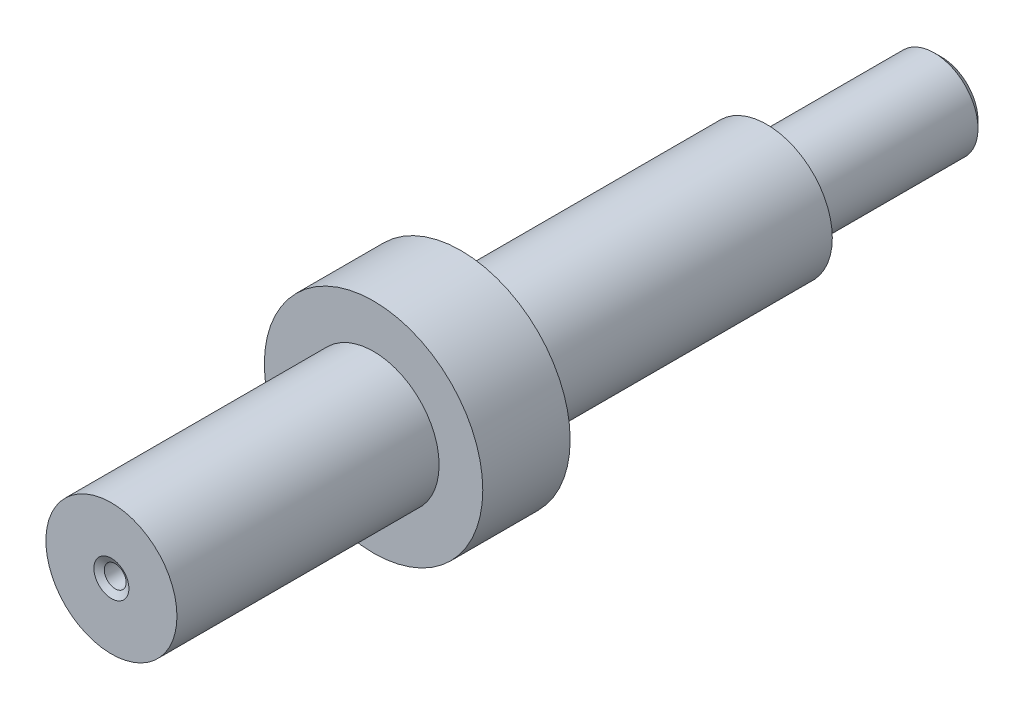
ISO-10303-21;
HEADER;
FILE_DESCRIPTION(('STEP AP214'),'2;1');
FILE_NAME('part.step','',(''),(''),'','','');
FILE_SCHEMA(('AUTOMOTIVE_DESIGN { 1 0 10303 214 1 1 1 1 }'));
ENDSEC;
DATA;
#1=APPLICATION_CONTEXT('core data for automotive mechanical design processes');
#2=APPLICATION_PROTOCOL_DEFINITION('international standard','automotive_design',2000,#1);
#3=PRODUCT_CONTEXT('',#1,'mechanical');
#4=PRODUCT('Part','Part','',(#3));
#5=PRODUCT_RELATED_PRODUCT_CATEGORY('part','',(#4));
#6=PRODUCT_DEFINITION_FORMATION('','',#4);
#7=PRODUCT_DEFINITION_CONTEXT('part definition',#1,'design');
#8=PRODUCT_DEFINITION('design','',#6,#7);
#9=PRODUCT_DEFINITION_SHAPE('','',#8);
#10=(LENGTH_UNIT() NAMED_UNIT(*) SI_UNIT(.MILLI.,.METRE.));
#11=(NAMED_UNIT(*) PLANE_ANGLE_UNIT() SI_UNIT($,.RADIAN.));
#12=(NAMED_UNIT(*) SI_UNIT($,.STERADIAN.) SOLID_ANGLE_UNIT());
#13=UNCERTAINTY_MEASURE_WITH_UNIT(LENGTH_MEASURE(1.E-05),#10,'distance_accuracy_value','');
#14=(GEOMETRIC_REPRESENTATION_CONTEXT(3) GLOBAL_UNCERTAINTY_ASSIGNED_CONTEXT((#13)) GLOBAL_UNIT_ASSIGNED_CONTEXT((#10,
#11,#12)) REPRESENTATION_CONTEXT('',''));
#15=CARTESIAN_POINT('',(0.,0.,0.));
#16=DIRECTION('',(0.,0.,1.));
#17=DIRECTION('',(1.,0.,0.));
#18=AXIS2_PLACEMENT_3D('',#15,#16,#17);
#19=CARTESIAN_POINT('',(0.,0.,10.));
#20=DIRECTION('',(0.,0.,-1.));
#21=DIRECTION('',(-1.,0.,0.));
#22=AXIS2_PLACEMENT_3D('',#19,#20,#21);
#23=CYLINDRICAL_SURFACE('',#22,12.5);
#24=CARTESIAN_POINT('',(0.,0.,10.));
#25=DIRECTION('',(0.,0.,1.));
#26=DIRECTION('',(1.,0.,0.));
#27=AXIS2_PLACEMENT_3D('',#24,#25,#26);
#28=CIRCLE('',#27,12.5);
#29=CARTESIAN_POINT('',(12.5,0.,10.));
#30=VERTEX_POINT('',#29);
#31=EDGE_CURVE('E173',#30,#30,#28,.T.);
#32=ORIENTED_EDGE('',*,*,#31,.F.);
#33=EDGE_LOOP('',(#32));
#34=FACE_BOUND('',#33,.T.);
#35=CARTESIAN_POINT('',(0.,0.,0.));
#36=DIRECTION('',(0.,0.,1.));
#37=DIRECTION('',(1.,0.,0.));
#38=AXIS2_PLACEMENT_3D('',#35,#36,#37);
#39=CIRCLE('',#38,12.5);
#40=CARTESIAN_POINT('',(12.5,0.,0.));
#41=VERTEX_POINT('',#40);
#42=EDGE_CURVE('E172',#41,#41,#39,.T.);
#43=ORIENTED_EDGE('',*,*,#42,.T.);
#44=EDGE_LOOP('',(#43));
#45=FACE_BOUND('',#44,.T.);
#46=ADVANCED_FACE('F46',(#34,#45),#23,.T.);
#47=CARTESIAN_POINT('',(0.,0.,10.));
#48=DIRECTION('',(0.,0.,1.));
#49=DIRECTION('',(1.,0.,0.));
#50=AXIS2_PLACEMENT_3D('',#47,#48,#49);
#51=PLANE('',#50);
#52=CARTESIAN_POINT('',(0.,0.,10.));
#53=DIRECTION('',(0.,0.,1.));
#54=DIRECTION('',(1.,0.,0.));
#55=AXIS2_PLACEMENT_3D('',#52,#53,#54);
#56=CIRCLE('',#55,7.5);
#57=CARTESIAN_POINT('',(7.5,0.,10.));
#58=VERTEX_POINT('',#57);
#59=EDGE_CURVE('E168',#58,#58,#56,.F.);
#60=ORIENTED_EDGE('',*,*,#59,.T.);
#61=EDGE_LOOP('',(#60));
#62=FACE_BOUND('',#61,.T.);
#63=ORIENTED_EDGE('',*,*,#31,.T.);
#64=EDGE_LOOP('',(#63));
#65=FACE_BOUND('',#64,.T.);
#66=ADVANCED_FACE('F225',(#62,#65),#51,.T.);
#67=CARTESIAN_POINT('',(0.,0.,0.));
#68=DIRECTION('',(0.,0.,1.));
#69=DIRECTION('',(1.,0.,0.));
#70=AXIS2_PLACEMENT_3D('',#67,#68,#69);
#71=PLANE('',#70);
#72=CARTESIAN_POINT('',(0.,0.,0.));
#73=DIRECTION('',(0.,0.,1.));
#74=DIRECTION('',(1.,0.,0.));
#75=AXIS2_PLACEMENT_3D('',#72,#73,#74);
#76=CIRCLE('',#75,7.5);
#77=CARTESIAN_POINT('',(-7.5,0.,0.));
#78=VERTEX_POINT('',#77);
#79=EDGE_CURVE('E177',#78,#78,#76,.F.);
#80=ORIENTED_EDGE('',*,*,#79,.F.);
#81=EDGE_LOOP('',(#80));
#82=FACE_BOUND('',#81,.T.);
#83=ORIENTED_EDGE('',*,*,#42,.F.);
#84=EDGE_LOOP('',(#83));
#85=FACE_BOUND('',#84,.T.);
#86=ADVANCED_FACE('F230',(#82,#85),#71,.F.);
#87=CARTESIAN_POINT('',(0.,0.,40.));
#88=DIRECTION('',(0.,0.,-1.));
#89=DIRECTION('',(-1.,0.,0.));
#90=AXIS2_PLACEMENT_3D('',#87,#88,#89);
#91=CYLINDRICAL_SURFACE('',#90,7.5);
#92=ORIENTED_EDGE('',*,*,#59,.F.);
#93=EDGE_LOOP('',(#92));
#94=FACE_BOUND('',#93,.T.);
#95=CARTESIAN_POINT('',(0.,0.,40.));
#96=DIRECTION('',(0.,0.,1.));
#97=DIRECTION('',(1.,0.,0.));
#98=AXIS2_PLACEMENT_3D('',#95,#96,#97);
#99=CIRCLE('',#98,7.5);
#100=CARTESIAN_POINT('',(7.5,0.,40.));
#101=VERTEX_POINT('',#100);
#102=EDGE_CURVE('E164',#101,#101,#99,.T.);
#103=ORIENTED_EDGE('',*,*,#102,.F.);
#104=EDGE_LOOP('',(#103));
#105=FACE_BOUND('',#104,.T.);
#106=ADVANCED_FACE('F238',(#94,#105),#91,.T.);
#107=CARTESIAN_POINT('',(0.,0.,40.));
#108=DIRECTION('',(0.,0.,1.));
#109=DIRECTION('',(1.,0.,0.));
#110=AXIS2_PLACEMENT_3D('',#107,#108,#109);
#111=PLANE('',#110);
#112=CARTESIAN_POINT('',(0.,0.,40.));
#113=DIRECTION('',(0.,0.,1.));
#114=DIRECTION('',(1.,0.,0.));
#115=AXIS2_PLACEMENT_3D('',#112,#113,#114);
#116=CIRCLE('',#115,2.);
#117=CARTESIAN_POINT('',(2.,0.,40.));
#118=VERTEX_POINT('',#117);
#119=EDGE_CURVE('E152',#118,#118,#116,.T.);
#120=ORIENTED_EDGE('',*,*,#119,.F.);
#121=EDGE_LOOP('',(#120));
#122=FACE_BOUND('',#121,.T.);
#123=ORIENTED_EDGE('',*,*,#102,.T.);
#124=EDGE_LOOP('',(#123));
#125=FACE_BOUND('',#124,.T.);
#126=ADVANCED_FACE('F243',(#122,#125),#111,.T.);
#127=CARTESIAN_POINT('',(0.,0.,-55.));
#128=DIRECTION('',(0.,0.,1.));
#129=DIRECTION('',(1.,0.,0.));
#130=AXIS2_PLACEMENT_3D('',#127,#128,#129);
#131=CYLINDRICAL_SURFACE('',#130,7.5);
#132=CARTESIAN_POINT('',(0.,0.,-35.));
#133=DIRECTION('',(0.,0.,1.));
#134=DIRECTION('',(1.,0.,0.));
#135=AXIS2_PLACEMENT_3D('',#132,#133,#134);
#136=CIRCLE('',#135,7.5);
#137=CARTESIAN_POINT('',(-7.22841614740048,-2.,-35.));
#138=VERTEX_POINT('',#137);
#139=CARTESIAN_POINT('',(-7.22841614740048,2.,-35.));
#140=VERTEX_POINT('',#139);
#141=EDGE_CURVE('E119',#138,#140,#136,.T.);
#142=ORIENTED_EDGE('',*,*,#141,.T.);
#143=DIRECTION('',(0.,0.,1.));
#144=VECTOR('',#143,1.);
#145=CARTESIAN_POINT('',(-7.22841614740048,2.,-55.));
#146=LINE('',#145,#144);
#147=CARTESIAN_POINT('',(-7.22841614740048,2.,-2.));
#148=VERTEX_POINT('',#147);
#149=EDGE_CURVE('E133',#140,#148,#146,.T.);
#150=ORIENTED_EDGE('',*,*,#149,.T.);
#151=CARTESIAN_POINT('',(-7.22841614740048,2.,-2.));
#152=CARTESIAN_POINT('',(-7.22841211731788,2.00000081983303,-1.94480520881582));
#153=CARTESIAN_POINT('',(-7.2290491358612,1.99771369246751,-1.88963790499004));
#154=CARTESIAN_POINT('',(-7.23156375544419,1.9885972357074,-1.77971850557565));
#155=CARTESIAN_POINT('',(-7.23344112607836,1.98176874990554,-1.72496633478295));
#156=CARTESIAN_POINT('',(-7.24085686185621,1.95457557497987,-1.56217160717843));
#157=CARTESIAN_POINT('',(-7.24817935036391,1.92750268707176,-1.45525193324513));
#158=CARTESIAN_POINT('',(-7.26672221014588,1.85636209583995,-1.24768704363347));
#159=CARTESIAN_POINT('',(-7.27794190561039,1.81229733890903,-1.14704074366387));
#160=CARTESIAN_POINT('',(-7.30300813868027,1.70848322793951,-0.954511416954225));
#161=CARTESIAN_POINT('',(-7.31685554362023,1.64872869263103,-0.862631298780205));
#162=CARTESIAN_POINT('',(-7.34600093818647,1.51365040710564,-0.688008678369283));
#163=CARTESIAN_POINT('',(-7.36132450422142,1.43800740131203,-0.605517461992623));
#164=CARTESIAN_POINT('',(-7.39147614932696,1.27397948568827,-0.454222834306024));
#165=CARTESIAN_POINT('',(-7.40630414763424,1.18559251131008,-0.385421645114002));
#166=CARTESIAN_POINT('',(-7.43408021450416,0.99683590986838,-0.262413491367762));
#167=CARTESIAN_POINT('',(-7.44699437298771,0.896297050460054,-0.208457898865626));
#168=CARTESIAN_POINT('',(-7.4691917041724,0.687177901515747,-0.118313673839034));
#169=CARTESIAN_POINT('',(-7.47847566029373,0.5785993530168,-0.0821212074911215));
#170=CARTESIAN_POINT('',(-7.49218546136373,0.359117146901224,-0.0293450582199145));
#171=CARTESIAN_POINT('',(-7.49671766938884,0.248323642566856,-0.0123313910719507));
#172=CARTESIAN_POINT('',(-7.5007852554996,0.0253660000268818,0.00295715413062727));
#173=CARTESIAN_POINT('',(-7.50032136133914,-0.0867979361781993,0.00123476136045844));
#174=CARTESIAN_POINT('',(-7.49452674486994,-0.306314760877309,-0.0205978619623029));
#175=CARTESIAN_POINT('',(-7.48931908956447,-0.413717637011894,-0.0402431403509407));
#176=CARTESIAN_POINT('',(-7.47476739620359,-0.623642304521193,-0.0966124989052113));
#177=CARTESIAN_POINT('',(-7.46542316205161,-0.726163864239471,-0.133337388742452));
#178=CARTESIAN_POINT('',(-7.44346557967562,-0.924604944640784,-0.223180273318852));
#179=CARTESIAN_POINT('',(-7.43082062276522,-1.02044860803468,-0.276457774603473));
#180=CARTESIAN_POINT('',(-7.40362439329212,-1.20199173400091,-0.39777029580329));
#181=CARTESIAN_POINT('',(-7.38907278755842,-1.28768941865434,-0.465807896288465));
#182=CARTESIAN_POINT('',(-7.35911436310182,-1.44927650588633,-0.617168174733981));
#183=CARTESIAN_POINT('',(-7.34369500037868,-1.5247855415025,-0.700894860728501));
#184=CARTESIAN_POINT('',(-7.31413713098087,-1.66080031054575,-0.880005559191824));
#185=CARTESIAN_POINT('',(-7.29999897939885,-1.72130189262124,-0.975392786322917));
#186=CARTESIAN_POINT('',(-7.27455088700726,-1.82587959040843,-1.17595793170073));
#187=CARTESIAN_POINT('',(-7.26326050655593,-1.86984307275388,-1.28119709986646));
#188=CARTESIAN_POINT('',(-7.24503473683015,-1.93927349960345,-1.49788887788862));
#189=CARTESIAN_POINT('',(-7.23809280698437,-1.96476823231961,-1.60933188018719));
#190=CARTESIAN_POINT('',(-7.23198573108967,-1.98706167698203,-1.7681379606476));
#191=CARTESIAN_POINT('',(-7.23064946437022,-1.99191398956404,-1.81440444229023));
#192=CARTESIAN_POINT('',(-7.22886491746628,-1.99837971479532,-1.90710646730822));
#193=CARTESIAN_POINT('',(-7.22841523283886,-1.99999825015568,-1.95354162636701));
#194=CARTESIAN_POINT('',(-7.22841614740048,-2.,-2.));
#195=B_SPLINE_CURVE_WITH_KNOTS('',3,(#151,#152,#153,#154,#155,#156,#157,#158,#159,#160,#161,
#162,#163,#164,#165,#166,#167,#168,#169,#170,#171,#172,#173,#174,#175,#176,#177,#178,#179,#180,
#181,#182,#183,#184,#185,#186,#187,#188,#189,#190,#191,#192,#193,#194),.UNSPECIFIED.,.F.,.F.,(4,
2,2,2,2,2,2,2,2,2,2,2,2,2,2,2,2,2,2,2,2,4),(0.,0.165479335439026,0.330927940384259,
0.660821769203835,0.990658420085612,1.32060413093787,1.65795310683046,1.9953567954553,
2.33816399210233,2.68089716794646,3.01578322846142,3.35062050868316,3.67701110172494,
4.0034171691315,4.33307162311823,4.6627837584895,5.00258485843318,5.34247984936635,
5.68464951048857,6.0263032653091,6.16582316237224,6.30512186652117),.UNSPECIFIED.);
#196=EDGE_CURVE('E11',#148,#78,#195,.T.);
#197=ORIENTED_EDGE('',*,*,#196,.T.);
#198=ORIENTED_EDGE('',*,*,#79,.T.);
#199=CARTESIAN_POINT('',(-7.22841614740048,-2.,-2.));
#200=VERTEX_POINT('',#199);
#201=EDGE_CURVE('E49',#78,#200,#195,.T.);
#202=ORIENTED_EDGE('',*,*,#201,.T.);
#203=DIRECTION('',(0.,0.,1.));
#204=VECTOR('',#203,1.);
#205=CARTESIAN_POINT('',(-7.22841614740048,-2.00000000000001,-55.));
#206=LINE('',#205,#204);
#207=EDGE_CURVE('E130',#200,#138,#206,.F.);
#208=ORIENTED_EDGE('',*,*,#207,.T.);
#209=EDGE_LOOP('',(#142,#150,#197,#198,#202,#208));
#210=FACE_BOUND('',#209,.T.);
#211=ADVANCED_FACE('F188',(#210),#131,.T.);
#212=CARTESIAN_POINT('',(0.,0.,25.));
#213=DIRECTION('',(0.,0.,1.));
#214=DIRECTION('',(1.,0.,0.));
#215=AXIS2_PLACEMENT_3D('',#212,#213,#214);
#216=CONICAL_SURFACE('',#215,1.24999999999999,1.02974425867665);
#217=CARTESIAN_POINT('',(0.,0.,24.2489242262156));
#218=VERTEX_POINT('',#217);
#219=VERTEX_LOOP('',#218);
#220=FACE_BOUND('',#219,.T.);
#221=CARTESIAN_POINT('',(0.,0.,25.));
#222=DIRECTION('',(0.,0.,1.));
#223=DIRECTION('',(1.,0.,0.));
#224=AXIS2_PLACEMENT_3D('',#221,#222,#223);
#225=CIRCLE('',#224,1.24999999999999);
#226=CARTESIAN_POINT('',(1.24999999999999,0.,25.));
#227=VERTEX_POINT('',#226);
#228=EDGE_CURVE('E160',#227,#227,#225,.T.);
#229=ORIENTED_EDGE('',*,*,#228,.T.);
#230=EDGE_LOOP('',(#229));
#231=FACE_BOUND('',#230,.T.);
#232=ADVANCED_FACE('F252',(#220,#231),#216,.F.);
#233=CARTESIAN_POINT('',(0.,0.,40.));
#234=DIRECTION('',(0.,0.,1.));
#235=DIRECTION('',(1.,0.,0.));
#236=AXIS2_PLACEMENT_3D('',#233,#234,#235);
#237=CYLINDRICAL_SURFACE('',#236,1.24999999999999);
#238=ORIENTED_EDGE('',*,*,#228,.F.);
#239=EDGE_LOOP('',(#238));
#240=FACE_BOUND('',#239,.T.);
#241=CARTESIAN_POINT('',(0.,0.,39.5669872981078));
#242=DIRECTION('',(0.,0.,1.));
#243=DIRECTION('',(1.,0.,0.));
#244=AXIS2_PLACEMENT_3D('',#241,#242,#243);
#245=CIRCLE('',#244,1.25);
#246=CARTESIAN_POINT('',(1.25,0.,39.5669872981078));
#247=VERTEX_POINT('',#246);
#248=EDGE_CURVE('E156',#247,#247,#245,.T.);
#249=ORIENTED_EDGE('',*,*,#248,.T.);
#250=EDGE_LOOP('',(#249));
#251=FACE_BOUND('',#250,.T.);
#252=ADVANCED_FACE('F259',(#240,#251),#237,.F.);
#253=CARTESIAN_POINT('',(0.,0.,40.));
#254=DIRECTION('',(0.,0.,1.));
#255=DIRECTION('',(1.,0.,0.));
#256=AXIS2_PLACEMENT_3D('',#253,#254,#255);
#257=CONICAL_SURFACE('',#256,2.,1.0471975511966);
#258=ORIENTED_EDGE('',*,*,#248,.F.);
#259=EDGE_LOOP('',(#258));
#260=FACE_BOUND('',#259,.T.);
#261=ORIENTED_EDGE('',*,*,#119,.T.);
#262=EDGE_LOOP('',(#261));
#263=FACE_BOUND('',#262,.T.);
#264=ADVANCED_FACE('F262',(#260,#263),#257,.F.);
#265=CARTESIAN_POINT('',(0.,0.,-55.));
#266=DIRECTION('',(0.,0.,1.));
#267=DIRECTION('',(1.,0.,0.));
#268=AXIS2_PLACEMENT_3D('',#265,#266,#267);
#269=CYLINDRICAL_SURFACE('',#268,5.);
#270=CARTESIAN_POINT('',(0.,0.,-35.));
#271=DIRECTION('',(0.,0.,1.));
#272=DIRECTION('',(1.,0.,0.));
#273=AXIS2_PLACEMENT_3D('',#270,#271,#272);
#274=CIRCLE('',#273,5.);
#275=CARTESIAN_POINT('',(5.,0.,-35.));
#276=VERTEX_POINT('',#275);
#277=EDGE_CURVE('E148',#276,#276,#274,.T.);
#278=ORIENTED_EDGE('',*,*,#277,.F.);
#279=EDGE_LOOP('',(#278));
#280=FACE_BOUND('',#279,.T.);
#281=CARTESIAN_POINT('',(0.,0.,-54.172));
#282=DIRECTION('',(0.,0.,1.));
#283=DIRECTION('',(1.,0.,0.));
#284=AXIS2_PLACEMENT_3D('',#281,#282,#283);
#285=CIRCLE('',#284,5.);
#286=CARTESIAN_POINT('',(5.,0.,-54.172));
#287=VERTEX_POINT('',#286);
#288=EDGE_CURVE('E138',#287,#287,#285,.T.);
#289=ORIENTED_EDGE('',*,*,#288,.T.);
#290=EDGE_LOOP('',(#289));
#291=FACE_BOUND('',#290,.T.);
#292=ADVANCED_FACE('F266',(#280,#291),#269,.T.);
#293=CARTESIAN_POINT('',(5.,0.,-35.));
#294=DIRECTION('',(0.,0.,1.));
#295=DIRECTION('',(1.,0.,0.));
#296=AXIS2_PLACEMENT_3D('',#293,#294,#295);
#297=PLANE('',#296);
#298=DIRECTION('',(0.,-1.,0.));
#299=VECTOR('',#298,1.);
#300=CARTESIAN_POINT('',(-5.5,-2.,-35.));
#301=LINE('',#300,#299);
#302=CARTESIAN_POINT('',(-5.5,2.,-35.));
#303=VERTEX_POINT('',#302);
#304=CARTESIAN_POINT('',(-5.5,-2.,-35.));
#305=VERTEX_POINT('',#304);
#306=EDGE_CURVE('E107',#303,#305,#301,.T.);
#307=ORIENTED_EDGE('',*,*,#306,.F.);
#308=DIRECTION('',(-1.,0.,0.));
#309=VECTOR('',#308,1.);
#310=CARTESIAN_POINT('',(-5.5,2.,-35.));
#311=LINE('',#310,#309);
#312=EDGE_CURVE('E134',#303,#140,#311,.T.);
#313=ORIENTED_EDGE('',*,*,#312,.T.);
#314=ORIENTED_EDGE('',*,*,#141,.F.);
#315=DIRECTION('',(-1.,0.,0.));
#316=VECTOR('',#315,1.);
#317=CARTESIAN_POINT('',(-5.5,-2.,-35.));
#318=LINE('',#317,#316);
#319=EDGE_CURVE('E100',#305,#138,#318,.T.);
#320=ORIENTED_EDGE('',*,*,#319,.F.);
#321=EDGE_LOOP('',(#307,#313,#314,#320));
#322=FACE_BOUND('',#321,.T.);
#323=ORIENTED_EDGE('',*,*,#277,.T.);
#324=EDGE_LOOP('',(#323));
#325=FACE_BOUND('',#324,.T.);
#326=ADVANCED_FACE('F116',(#322,#325),#297,.F.);
#327=CARTESIAN_POINT('',(0.,0.,-55.));
#328=DIRECTION('',(0.,0.,1.));
#329=DIRECTION('',(1.,0.,0.));
#330=AXIS2_PLACEMENT_3D('',#327,#328,#329);
#331=CONICAL_SURFACE('',#330,4.172,0.785398163397447);
#332=ORIENTED_EDGE('',*,*,#288,.F.);
#333=EDGE_LOOP('',(#332));
#334=FACE_BOUND('',#333,.T.);
#335=CARTESIAN_POINT('',(0.,0.,-55.));
#336=DIRECTION('',(0.,0.,1.));
#337=DIRECTION('',(1.,0.,0.));
#338=AXIS2_PLACEMENT_3D('',#335,#336,#337);
#339=CIRCLE('',#338,4.172);
#340=CARTESIAN_POINT('',(4.172,0.,-55.));
#341=VERTEX_POINT('',#340);
#342=EDGE_CURVE('E142',#341,#341,#339,.T.);
#343=ORIENTED_EDGE('',*,*,#342,.T.);
#344=EDGE_LOOP('',(#343));
#345=FACE_BOUND('',#344,.T.);
#346=ADVANCED_FACE('F255',(#334,#345),#331,.T.);
#347=CARTESIAN_POINT('',(0.,0.,-55.));
#348=DIRECTION('',(0.,0.,-1.));
#349=DIRECTION('',(-1.,0.,0.));
#350=AXIS2_PLACEMENT_3D('',#347,#348,#349);
#351=PLANE('',#350);
#352=ORIENTED_EDGE('',*,*,#342,.F.);
#353=EDGE_LOOP('',(#352));
#354=FACE_BOUND('',#353,.T.);
#355=ADVANCED_FACE('F222',(#354),#351,.T.);
#356=CARTESIAN_POINT('',(-5.5,0.,-2.));
#357=DIRECTION('',(-1.,0.,0.));
#358=DIRECTION('',(0.,0.,1.));
#359=AXIS2_PLACEMENT_3D('',#356,#357,#358);
#360=CYLINDRICAL_SURFACE('',#359,2.);
#361=DIRECTION('',(-1.,0.,0.));
#362=VECTOR('',#361,1.);
#363=CARTESIAN_POINT('',(-5.5,2.,-2.));
#364=LINE('',#363,#362);
#365=CARTESIAN_POINT('',(-5.5,2.,-2.));
#366=VERTEX_POINT('',#365);
#367=EDGE_CURVE('E125',#366,#148,#364,.T.);
#368=ORIENTED_EDGE('',*,*,#367,.F.);
#369=CARTESIAN_POINT('',(-5.5,0.,-2.));
#370=DIRECTION('',(-1.,0.,0.));
#371=DIRECTION('',(0.,0.,1.));
#372=AXIS2_PLACEMENT_3D('',#369,#370,#371);
#373=CIRCLE('',#372,2.);
#374=CARTESIAN_POINT('',(-5.5,-2.,-2.));
#375=VERTEX_POINT('',#374);
#376=EDGE_CURVE('E106',#375,#366,#373,.T.);
#377=ORIENTED_EDGE('',*,*,#376,.F.);
#378=DIRECTION('',(-1.,0.,0.));
#379=VECTOR('',#378,1.);
#380=CARTESIAN_POINT('',(-5.5,-2.,-2.));
#381=LINE('',#380,#379);
#382=EDGE_CURVE('E103',#375,#200,#381,.T.);
#383=ORIENTED_EDGE('',*,*,#382,.T.);
#384=ORIENTED_EDGE('',*,*,#201,.F.);
#385=ORIENTED_EDGE('',*,*,#196,.F.);
#386=EDGE_LOOP('',(#368,#377,#383,#384,#385));
#387=FACE_BOUND('',#386,.T.);
#388=ADVANCED_FACE('F190',(#387),#360,.F.);
#389=CARTESIAN_POINT('',(-5.5,2.,-35.));
#390=DIRECTION('',(0.,1.,0.));
#391=DIRECTION('',(0.,0.,1.));
#392=AXIS2_PLACEMENT_3D('',#389,#390,#391);
#393=PLANE('',#392);
#394=ORIENTED_EDGE('',*,*,#312,.F.);
#395=DIRECTION('',(0.,0.,-1.));
#396=VECTOR('',#395,1.);
#397=CARTESIAN_POINT('',(-5.5,2.,-35.));
#398=LINE('',#397,#396);
#399=EDGE_CURVE('E67',#366,#303,#398,.T.);
#400=ORIENTED_EDGE('',*,*,#399,.F.);
#401=ORIENTED_EDGE('',*,*,#367,.T.);
#402=ORIENTED_EDGE('',*,*,#149,.F.);
#403=EDGE_LOOP('',(#394,#400,#401,#402));
#404=FACE_BOUND('',#403,.T.);
#405=ADVANCED_FACE('F193',(#404),#393,.F.);
#406=CARTESIAN_POINT('',(-5.5,-2.,-2.));
#407=DIRECTION('',(0.,-1.,0.));
#408=DIRECTION('',(0.,0.,-1.));
#409=AXIS2_PLACEMENT_3D('',#406,#407,#408);
#410=PLANE('',#409);
#411=ORIENTED_EDGE('',*,*,#382,.F.);
#412=DIRECTION('',(0.,0.,1.));
#413=VECTOR('',#412,1.);
#414=CARTESIAN_POINT('',(-5.5,-2.,-2.));
#415=LINE('',#414,#413);
#416=EDGE_CURVE('E97',#305,#375,#415,.T.);
#417=ORIENTED_EDGE('',*,*,#416,.F.);
#418=ORIENTED_EDGE('',*,*,#319,.T.);
#419=ORIENTED_EDGE('',*,*,#207,.F.);
#420=EDGE_LOOP('',(#411,#417,#418,#419));
#421=FACE_BOUND('',#420,.T.);
#422=ADVANCED_FACE('F98',(#421),#410,.F.);
#423=CARTESIAN_POINT('',(-5.5,0.,-2.));
#424=DIRECTION('',(-1.,0.,0.));
#425=DIRECTION('',(0.,0.,1.));
#426=AXIS2_PLACEMENT_3D('',#423,#424,#425);
#427=PLANE('',#426);
#428=ORIENTED_EDGE('',*,*,#306,.T.);
#429=ORIENTED_EDGE('',*,*,#416,.T.);
#430=ORIENTED_EDGE('',*,*,#376,.T.);
#431=ORIENTED_EDGE('',*,*,#399,.T.);
#432=EDGE_LOOP('',(#428,#429,#430,#431));
#433=FACE_BOUND('',#432,.T.);
#434=ADVANCED_FACE('F110',(#433),#427,.T.);
#435=CLOSED_SHELL('',(#46,#66,#86,#106,#126,#211,#232,#252,#264,#292,#326,#346,#355,#388,#405,
#422,#434));
#436=MANIFOLD_SOLID_BREP('B2',#435);
#437=ADVANCED_BREP_SHAPE_REPRESENTATION('',(#18,#436),#14);
#438=SHAPE_DEFINITION_REPRESENTATION(#9,#437);
ENDSEC;
END-ISO-10303-21;
